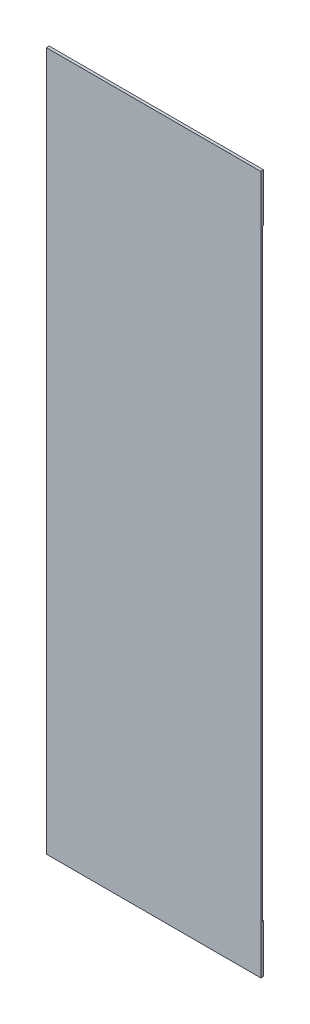
ISO-10303-21;
HEADER;
FILE_DESCRIPTION(('STEP AP214'),'2;1');
FILE_NAME('part.step','',(''),(''),'','','');
FILE_SCHEMA(('AUTOMOTIVE_DESIGN { 1 0 10303 214 1 1 1 1 }'));
ENDSEC;
DATA;
#1=APPLICATION_CONTEXT('core data for automotive mechanical design processes');
#2=APPLICATION_PROTOCOL_DEFINITION('international standard','automotive_design',2000,#1);
#3=PRODUCT_CONTEXT('',#1,'mechanical');
#4=PRODUCT('Part','Part','',(#3));
#5=PRODUCT_RELATED_PRODUCT_CATEGORY('part','',(#4));
#6=PRODUCT_DEFINITION_FORMATION('','',#4);
#7=PRODUCT_DEFINITION_CONTEXT('part definition',#1,'design');
#8=PRODUCT_DEFINITION('design','',#6,#7);
#9=PRODUCT_DEFINITION_SHAPE('','',#8);
#10=(LENGTH_UNIT() NAMED_UNIT(*) SI_UNIT(.MILLI.,.METRE.));
#11=(NAMED_UNIT(*) PLANE_ANGLE_UNIT() SI_UNIT($,.RADIAN.));
#12=(NAMED_UNIT(*) SI_UNIT($,.STERADIAN.) SOLID_ANGLE_UNIT());
#13=UNCERTAINTY_MEASURE_WITH_UNIT(LENGTH_MEASURE(1.E-05),#10,'distance_accuracy_value','');
#14=(GEOMETRIC_REPRESENTATION_CONTEXT(3) GLOBAL_UNCERTAINTY_ASSIGNED_CONTEXT((#13)) GLOBAL_UNIT_ASSIGNED_CONTEXT((#10,
#11,#12)) REPRESENTATION_CONTEXT('',''));
#15=CARTESIAN_POINT('',(0.,0.,0.));
#16=DIRECTION('',(0.,0.,1.));
#17=DIRECTION('',(1.,0.,0.));
#18=AXIS2_PLACEMENT_3D('',#15,#16,#17);
#19=CARTESIAN_POINT('',(-15.6,50.8,0.));
#20=DIRECTION('',(0.,1.,0.));
#21=DIRECTION('',(0.,0.,1.));
#22=AXIS2_PLACEMENT_3D('',#19,#20,#21);
#23=PLANE('',#22);
#24=DIRECTION('',(0.,0.,1.));
#25=VECTOR('',#24,1.);
#26=CARTESIAN_POINT('',(0.,50.8,0.));
#27=LINE('',#26,#25);
#28=CARTESIAN_POINT('',(0.,50.8,-0.200000000003319));
#29=VERTEX_POINT('',#28);
#30=CARTESIAN_POINT('',(0.,50.8,0.));
#31=VERTEX_POINT('',#30);
#32=EDGE_CURVE('E147',#29,#31,#27,.T.);
#33=ORIENTED_EDGE('',*,*,#32,.F.);
#34=DIRECTION('',(1.,0.,0.));
#35=VECTOR('',#34,1.);
#36=CARTESIAN_POINT('',(-15.6,50.8,-0.200000000003319));
#37=LINE('',#36,#35);
#38=CARTESIAN_POINT('',(-15.6,50.8,-0.200000000003319));
#39=VERTEX_POINT('',#38);
#40=EDGE_CURVE('E46',#39,#29,#37,.T.);
#41=ORIENTED_EDGE('',*,*,#40,.F.);
#42=DIRECTION('',(0.,0.,1.));
#43=VECTOR('',#42,1.);
#44=CARTESIAN_POINT('',(-15.6,50.8,0.));
#45=LINE('',#44,#43);
#46=CARTESIAN_POINT('',(-15.6,50.8,0.));
#47=VERTEX_POINT('',#46);
#48=EDGE_CURVE('E121',#39,#47,#45,.T.);
#49=ORIENTED_EDGE('',*,*,#48,.T.);
#50=DIRECTION('',(1.,0.,0.));
#51=VECTOR('',#50,1.);
#52=CARTESIAN_POINT('',(-15.6,50.8,0.));
#53=LINE('',#52,#51);
#54=EDGE_CURVE('E11',#47,#31,#53,.T.);
#55=ORIENTED_EDGE('',*,*,#54,.T.);
#56=EDGE_LOOP('',(#33,#41,#49,#55));
#57=FACE_BOUND('',#56,.T.);
#58=ADVANCED_FACE('F36',(#57),#23,.T.);
#59=CARTESIAN_POINT('',(-15.6,50.8,-0.200000000003319));
#60=DIRECTION('',(0.,0.,-1.));
#61=DIRECTION('',(-1.,0.,0.));
#62=AXIS2_PLACEMENT_3D('',#59,#60,#61);
#63=PLANE('',#62);
#64=DIRECTION('',(0.,1.,0.));
#65=VECTOR('',#64,1.);
#66=CARTESIAN_POINT('',(0.,50.8,-0.200000000003319));
#67=LINE('',#66,#65);
#68=CARTESIAN_POINT('',(0.,47.3000000000035,-0.200000000003319));
#69=VERTEX_POINT('',#68);
#70=EDGE_CURVE('E107',#69,#29,#67,.T.);
#71=ORIENTED_EDGE('',*,*,#70,.F.);
#72=DIRECTION('',(1.,0.,0.));
#73=VECTOR('',#72,1.);
#74=CARTESIAN_POINT('',(-15.6,47.3000000000035,-0.200000000003319));
#75=LINE('',#74,#73);
#76=CARTESIAN_POINT('',(-15.6,47.3000000000035,-0.200000000003319));
#77=VERTEX_POINT('',#76);
#78=EDGE_CURVE('E102',#77,#69,#75,.T.);
#79=ORIENTED_EDGE('',*,*,#78,.F.);
#80=DIRECTION('',(0.,1.,0.));
#81=VECTOR('',#80,1.);
#82=CARTESIAN_POINT('',(-15.6,50.8,-0.200000000003319));
#83=LINE('',#82,#81);
#84=EDGE_CURVE('E105',#77,#39,#83,.T.);
#85=ORIENTED_EDGE('',*,*,#84,.T.);
#86=ORIENTED_EDGE('',*,*,#40,.T.);
#87=EDGE_LOOP('',(#71,#79,#85,#86));
#88=FACE_BOUND('',#87,.T.);
#89=ADVANCED_FACE('F104',(#88),#63,.T.);
#90=CARTESIAN_POINT('',(-15.6,47.3000000000035,-0.200000000003319));
#91=DIRECTION('',(0.,-1.,0.));
#92=DIRECTION('',(0.,0.,-1.));
#93=AXIS2_PLACEMENT_3D('',#90,#91,#92);
#94=PLANE('',#93);
#95=DIRECTION('',(0.,0.,-1.));
#96=VECTOR('',#95,1.);
#97=CARTESIAN_POINT('',(0.,47.3000000000035,-0.200000000003319));
#98=LINE('',#97,#96);
#99=CARTESIAN_POINT('',(0.,47.3000000000035,-0.10000000000166));
#100=VERTEX_POINT('',#99);
#101=EDGE_CURVE('E144',#100,#69,#98,.T.);
#102=ORIENTED_EDGE('',*,*,#101,.F.);
#103=DIRECTION('',(1.,0.,0.));
#104=VECTOR('',#103,1.);
#105=CARTESIAN_POINT('',(-15.6,47.3000000000035,-0.10000000000166));
#106=LINE('',#105,#104);
#107=CARTESIAN_POINT('',(-15.6,47.3000000000035,-0.10000000000166));
#108=VERTEX_POINT('',#107);
#109=EDGE_CURVE('E112',#108,#100,#106,.T.);
#110=ORIENTED_EDGE('',*,*,#109,.F.);
#111=DIRECTION('',(0.,0.,-1.));
#112=VECTOR('',#111,1.);
#113=CARTESIAN_POINT('',(-15.6,47.3000000000035,-0.200000000003319));
#114=LINE('',#113,#112);
#115=EDGE_CURVE('E118',#108,#77,#114,.T.);
#116=ORIENTED_EDGE('',*,*,#115,.T.);
#117=ORIENTED_EDGE('',*,*,#78,.T.);
#118=EDGE_LOOP('',(#102,#110,#116,#117));
#119=FACE_BOUND('',#118,.T.);
#120=ADVANCED_FACE('F123',(#119),#94,.T.);
#121=CARTESIAN_POINT('',(-15.6,47.3000000000035,-0.10000000000166));
#122=DIRECTION('',(0.,0.,-1.));
#123=DIRECTION('',(0.,1.,0.));
#124=AXIS2_PLACEMENT_3D('',#121,#122,#123);
#125=PLANE('',#124);
#126=DIRECTION('',(0.,1.,0.));
#127=VECTOR('',#126,1.);
#128=CARTESIAN_POINT('',(0.,47.3000000000035,-0.10000000000166));
#129=LINE('',#128,#127);
#130=CARTESIAN_POINT('',(0.,3.50000000000125,-0.10000000000166));
#131=VERTEX_POINT('',#130);
#132=EDGE_CURVE('E141',#131,#100,#129,.T.);
#133=ORIENTED_EDGE('',*,*,#132,.F.);
#134=DIRECTION('',(1.,0.,0.));
#135=VECTOR('',#134,1.);
#136=CARTESIAN_POINT('',(-15.6,3.50000000000125,-0.10000000000166));
#137=LINE('',#136,#135);
#138=CARTESIAN_POINT('',(-15.6,3.50000000000125,-0.10000000000166));
#139=VERTEX_POINT('',#138);
#140=EDGE_CURVE('E152',#139,#131,#137,.T.);
#141=ORIENTED_EDGE('',*,*,#140,.F.);
#142=DIRECTION('',(0.,1.,0.));
#143=VECTOR('',#142,1.);
#144=CARTESIAN_POINT('',(-15.6,47.3000000000035,-0.10000000000166));
#145=LINE('',#144,#143);
#146=EDGE_CURVE('E124',#139,#108,#145,.T.);
#147=ORIENTED_EDGE('',*,*,#146,.T.);
#148=ORIENTED_EDGE('',*,*,#109,.T.);
#149=EDGE_LOOP('',(#133,#141,#147,#148));
#150=FACE_BOUND('',#149,.T.);
#151=ADVANCED_FACE('F177',(#150),#125,.T.);
#152=CARTESIAN_POINT('',(-15.6,3.50000000000125,-0.10000000000166));
#153=DIRECTION('',(0.,1.,0.));
#154=DIRECTION('',(0.,0.,1.));
#155=AXIS2_PLACEMENT_3D('',#152,#153,#154);
#156=PLANE('',#155);
#157=DIRECTION('',(0.,0.,1.));
#158=VECTOR('',#157,1.);
#159=CARTESIAN_POINT('',(0.,3.50000000000125,-0.10000000000166));
#160=LINE('',#159,#158);
#161=CARTESIAN_POINT('',(0.,3.50000000000125,-0.200000000003319));
#162=VERTEX_POINT('',#161);
#163=EDGE_CURVE('E138',#162,#131,#160,.T.);
#164=ORIENTED_EDGE('',*,*,#163,.F.);
#165=DIRECTION('',(1.,0.,0.));
#166=VECTOR('',#165,1.);
#167=CARTESIAN_POINT('',(-15.6,3.50000000000125,-0.200000000003319));
#168=LINE('',#167,#166);
#169=CARTESIAN_POINT('',(-15.6,3.50000000000125,-0.200000000003319));
#170=VERTEX_POINT('',#169);
#171=EDGE_CURVE('E154',#170,#162,#168,.T.);
#172=ORIENTED_EDGE('',*,*,#171,.F.);
#173=DIRECTION('',(0.,0.,1.));
#174=VECTOR('',#173,1.);
#175=CARTESIAN_POINT('',(-15.6,3.50000000000125,-0.10000000000166));
#176=LINE('',#175,#174);
#177=EDGE_CURVE('E126',#170,#139,#176,.T.);
#178=ORIENTED_EDGE('',*,*,#177,.T.);
#179=ORIENTED_EDGE('',*,*,#140,.T.);
#180=EDGE_LOOP('',(#164,#172,#178,#179));
#181=FACE_BOUND('',#180,.T.);
#182=ADVANCED_FACE('F180',(#181),#156,.T.);
#183=CARTESIAN_POINT('',(-15.6,0.,-0.200000000003319));
#184=DIRECTION('',(0.,0.,-1.));
#185=DIRECTION('',(-1.,0.,0.));
#186=AXIS2_PLACEMENT_3D('',#183,#184,#185);
#187=PLANE('',#186);
#188=DIRECTION('',(0.,1.,0.));
#189=VECTOR('',#188,1.);
#190=CARTESIAN_POINT('',(0.,0.,-0.200000000003319));
#191=LINE('',#190,#189);
#192=CARTESIAN_POINT('',(0.,0.,-0.200000000003319));
#193=VERTEX_POINT('',#192);
#194=EDGE_CURVE('E135',#193,#162,#191,.T.);
#195=ORIENTED_EDGE('',*,*,#194,.F.);
#196=DIRECTION('',(1.,0.,0.));
#197=VECTOR('',#196,1.);
#198=CARTESIAN_POINT('',(-15.6,0.,-0.200000000003319));
#199=LINE('',#198,#197);
#200=CARTESIAN_POINT('',(-15.6,0.,-0.200000000003319));
#201=VERTEX_POINT('',#200);
#202=EDGE_CURVE('E155',#201,#193,#199,.T.);
#203=ORIENTED_EDGE('',*,*,#202,.F.);
#204=DIRECTION('',(0.,1.,0.));
#205=VECTOR('',#204,1.);
#206=CARTESIAN_POINT('',(-15.6,0.,-0.200000000003319));
#207=LINE('',#206,#205);
#208=EDGE_CURVE('E262',#201,#170,#207,.T.);
#209=ORIENTED_EDGE('',*,*,#208,.T.);
#210=ORIENTED_EDGE('',*,*,#171,.T.);
#211=EDGE_LOOP('',(#195,#203,#209,#210));
#212=FACE_BOUND('',#211,.T.);
#213=ADVANCED_FACE('F184',(#212),#187,.T.);
#214=CARTESIAN_POINT('',(-15.6,0.,0.));
#215=DIRECTION('',(0.,-1.,0.));
#216=DIRECTION('',(0.,0.,-1.));
#217=AXIS2_PLACEMENT_3D('',#214,#215,#216);
#218=PLANE('',#217);
#219=DIRECTION('',(0.,0.,-1.));
#220=VECTOR('',#219,1.);
#221=CARTESIAN_POINT('',(0.,0.,0.));
#222=LINE('',#221,#220);
#223=CARTESIAN_POINT('',(0.,0.,0.));
#224=VERTEX_POINT('',#223);
#225=EDGE_CURVE('E132',#224,#193,#222,.T.);
#226=ORIENTED_EDGE('',*,*,#225,.F.);
#227=DIRECTION('',(1.,0.,0.));
#228=VECTOR('',#227,1.);
#229=CARTESIAN_POINT('',(-15.6,0.,0.));
#230=LINE('',#229,#228);
#231=CARTESIAN_POINT('',(-15.6,0.,0.));
#232=VERTEX_POINT('',#231);
#233=EDGE_CURVE('E40',#232,#224,#230,.T.);
#234=ORIENTED_EDGE('',*,*,#233,.F.);
#235=DIRECTION('',(0.,0.,-1.));
#236=VECTOR('',#235,1.);
#237=CARTESIAN_POINT('',(-15.6,0.,0.));
#238=LINE('',#237,#236);
#239=EDGE_CURVE('E263',#232,#201,#238,.T.);
#240=ORIENTED_EDGE('',*,*,#239,.T.);
#241=ORIENTED_EDGE('',*,*,#202,.T.);
#242=EDGE_LOOP('',(#226,#234,#240,#241));
#243=FACE_BOUND('',#242,.T.);
#244=ADVANCED_FACE('F161',(#243),#218,.T.);
#245=CARTESIAN_POINT('',(-15.6,0.,0.));
#246=DIRECTION('',(0.,0.,1.));
#247=DIRECTION('',(1.,0.,0.));
#248=AXIS2_PLACEMENT_3D('',#245,#246,#247);
#249=PLANE('',#248);
#250=DIRECTION('',(0.,-1.,0.));
#251=VECTOR('',#250,1.);
#252=CARTESIAN_POINT('',(0.,0.,0.));
#253=LINE('',#252,#251);
#254=EDGE_CURVE('E85',#31,#224,#253,.T.);
#255=ORIENTED_EDGE('',*,*,#254,.F.);
#256=ORIENTED_EDGE('',*,*,#54,.F.);
#257=DIRECTION('',(0.,-1.,0.));
#258=VECTOR('',#257,1.);
#259=CARTESIAN_POINT('',(-15.6,50.8,0.));
#260=LINE('',#259,#258);
#261=EDGE_CURVE('E88',#47,#232,#260,.T.);
#262=ORIENTED_EDGE('',*,*,#261,.T.);
#263=ORIENTED_EDGE('',*,*,#233,.T.);
#264=EDGE_LOOP('',(#255,#256,#262,#263));
#265=FACE_BOUND('',#264,.T.);
#266=ADVANCED_FACE('F38',(#265),#249,.T.);
#267=CARTESIAN_POINT('',(-15.6,0.,0.));
#268=DIRECTION('',(1.,0.,0.));
#269=DIRECTION('',(0.,0.,-1.));
#270=AXIS2_PLACEMENT_3D('',#267,#268,#269);
#271=PLANE('',#270);
#272=ORIENTED_EDGE('',*,*,#261,.F.);
#273=ORIENTED_EDGE('',*,*,#48,.F.);
#274=ORIENTED_EDGE('',*,*,#84,.F.);
#275=ORIENTED_EDGE('',*,*,#115,.F.);
#276=ORIENTED_EDGE('',*,*,#146,.F.);
#277=ORIENTED_EDGE('',*,*,#177,.F.);
#278=ORIENTED_EDGE('',*,*,#208,.F.);
#279=ORIENTED_EDGE('',*,*,#239,.F.);
#280=EDGE_LOOP('',(#272,#273,#274,#275,#276,#277,#278,#279));
#281=FACE_BOUND('',#280,.T.);
#282=ADVANCED_FACE('F116',(#281),#271,.F.);
#283=CARTESIAN_POINT('',(0.,0.,0.));
#284=DIRECTION('',(1.,0.,0.));
#285=DIRECTION('',(0.,0.,-1.));
#286=AXIS2_PLACEMENT_3D('',#283,#284,#285);
#287=PLANE('',#286);
#288=ORIENTED_EDGE('',*,*,#32,.T.);
#289=ORIENTED_EDGE('',*,*,#254,.T.);
#290=ORIENTED_EDGE('',*,*,#225,.T.);
#291=ORIENTED_EDGE('',*,*,#194,.T.);
#292=ORIENTED_EDGE('',*,*,#163,.T.);
#293=ORIENTED_EDGE('',*,*,#132,.T.);
#294=ORIENTED_EDGE('',*,*,#101,.T.);
#295=ORIENTED_EDGE('',*,*,#70,.T.);
#296=EDGE_LOOP('',(#288,#289,#290,#291,#292,#293,#294,#295));
#297=FACE_BOUND('',#296,.T.);
#298=ADVANCED_FACE('F163',(#297),#287,.T.);
#299=CLOSED_SHELL('',(#58,#89,#120,#151,#182,#213,#244,#266,#282,#298));
#300=MANIFOLD_SOLID_BREP('B2',#299);
#301=ADVANCED_BREP_SHAPE_REPRESENTATION('',(#18,#300),#14);
#302=SHAPE_DEFINITION_REPRESENTATION(#9,#301);
ENDSEC;
END-ISO-10303-21;
